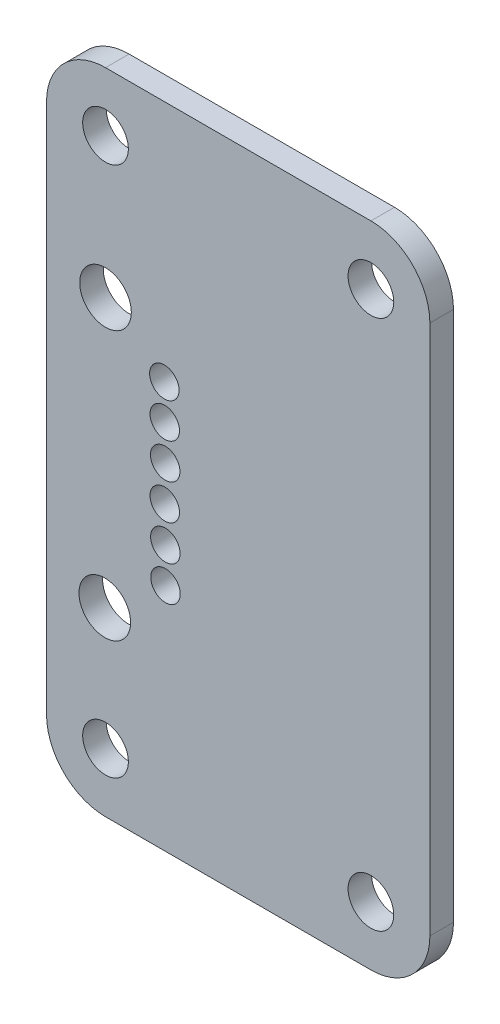
ISO-10303-21;
HEADER;
FILE_DESCRIPTION(('STEP AP214'),'2;1');
FILE_NAME('part.step','',(''),(''),'','','');
FILE_SCHEMA(('AUTOMOTIVE_DESIGN { 1 0 10303 214 1 1 1 1 }'));
ENDSEC;
DATA;
#1=APPLICATION_CONTEXT('core data for automotive mechanical design processes');
#2=APPLICATION_PROTOCOL_DEFINITION('international standard','automotive_design',2000,#1);
#3=PRODUCT_CONTEXT('',#1,'mechanical');
#4=PRODUCT('Part','Part','',(#3));
#5=PRODUCT_RELATED_PRODUCT_CATEGORY('part','',(#4));
#6=PRODUCT_DEFINITION_FORMATION('','',#4);
#7=PRODUCT_DEFINITION_CONTEXT('part definition',#1,'design');
#8=PRODUCT_DEFINITION('design','',#6,#7);
#9=PRODUCT_DEFINITION_SHAPE('','',#8);
#10=(LENGTH_UNIT() NAMED_UNIT(*) SI_UNIT(.MILLI.,.METRE.));
#11=(NAMED_UNIT(*) PLANE_ANGLE_UNIT() SI_UNIT($,.RADIAN.));
#12=(NAMED_UNIT(*) SI_UNIT($,.STERADIAN.) SOLID_ANGLE_UNIT());
#13=UNCERTAINTY_MEASURE_WITH_UNIT(LENGTH_MEASURE(1.E-05),#10,'distance_accuracy_value','');
#14=(GEOMETRIC_REPRESENTATION_CONTEXT(3) GLOBAL_UNCERTAINTY_ASSIGNED_CONTEXT((#13)) GLOBAL_UNIT_ASSIGNED_CONTEXT((#10,
#11,#12)) REPRESENTATION_CONTEXT('',''));
#15=CARTESIAN_POINT('',(0.,0.,0.));
#16=DIRECTION('',(0.,0.,1.));
#17=DIRECTION('',(1.,0.,0.));
#18=AXIS2_PLACEMENT_3D('',#15,#16,#17);
#19=CARTESIAN_POINT('',(-13.,18.,1.6));
#20=DIRECTION('',(0.,0.,-1.));
#21=DIRECTION('',(-1.,0.,0.));
#22=AXIS2_PLACEMENT_3D('',#19,#20,#21);
#23=PLANE('',#22);
#24=CARTESIAN_POINT('',(-9.,18.,1.6));
#25=DIRECTION('',(0.,0.,1.));
#26=DIRECTION('',(1.,0.,0.));
#27=AXIS2_PLACEMENT_3D('',#24,#25,#26);
#28=CIRCLE('',#27,1.55);
#29=CARTESIAN_POINT('',(-7.45,18.,1.6));
#30=VERTEX_POINT('',#29);
#31=EDGE_CURVE('E161',#30,#30,#28,.F.);
#32=ORIENTED_EDGE('',*,*,#31,.T.);
#33=EDGE_LOOP('',(#32));
#34=FACE_BOUND('',#33,.T.);
#35=CARTESIAN_POINT('',(9.,18.,1.6));
#36=DIRECTION('',(0.,0.,1.));
#37=DIRECTION('',(1.,0.,0.));
#38=AXIS2_PLACEMENT_3D('',#35,#36,#37);
#39=CIRCLE('',#38,1.55);
#40=CARTESIAN_POINT('',(10.55,18.,1.6));
#41=VERTEX_POINT('',#40);
#42=EDGE_CURVE('E164',#41,#41,#39,.F.);
#43=ORIENTED_EDGE('',*,*,#42,.T.);
#44=EDGE_LOOP('',(#43));
#45=FACE_BOUND('',#44,.T.);
#46=CARTESIAN_POINT('',(9.,-18.,1.6));
#47=DIRECTION('',(0.,0.,1.));
#48=DIRECTION('',(1.,0.,0.));
#49=AXIS2_PLACEMENT_3D('',#46,#47,#48);
#50=CIRCLE('',#49,1.55);
#51=CARTESIAN_POINT('',(10.55,-18.,1.6));
#52=VERTEX_POINT('',#51);
#53=EDGE_CURVE('E170',#52,#52,#50,.F.);
#54=ORIENTED_EDGE('',*,*,#53,.T.);
#55=EDGE_LOOP('',(#54));
#56=FACE_BOUND('',#55,.T.);
#57=CARTESIAN_POINT('',(-9.,8.5,1.6));
#58=DIRECTION('',(0.,0.,1.));
#59=DIRECTION('',(1.,0.,0.));
#60=AXIS2_PLACEMENT_3D('',#57,#58,#59);
#61=CIRCLE('',#60,1.75);
#62=CARTESIAN_POINT('',(-7.25,8.5,1.6));
#63=VERTEX_POINT('',#62);
#64=EDGE_CURVE('E176',#63,#63,#61,.F.);
#65=ORIENTED_EDGE('',*,*,#64,.T.);
#66=EDGE_LOOP('',(#65));
#67=FACE_BOUND('',#66,.T.);
#68=CARTESIAN_POINT('',(-4.982,-1.62158,1.6));
#69=DIRECTION('',(0.,0.,1.));
#70=DIRECTION('',(1.,0.,0.));
#71=AXIS2_PLACEMENT_3D('',#68,#69,#70);
#72=CIRCLE('',#71,1.);
#73=CARTESIAN_POINT('',(-3.982,-1.62158,1.6));
#74=VERTEX_POINT('',#73);
#75=EDGE_CURVE('E179',#74,#74,#72,.F.);
#76=ORIENTED_EDGE('',*,*,#75,.T.);
#77=EDGE_LOOP('',(#76));
#78=FACE_BOUND('',#77,.T.);
#79=CARTESIAN_POINT('',(-4.95152,0.79396,1.6));
#80=DIRECTION('',(0.,0.,1.));
#81=DIRECTION('',(1.,0.,0.));
#82=AXIS2_PLACEMENT_3D('',#79,#80,#81);
#83=CIRCLE('',#82,1.);
#84=CARTESIAN_POINT('',(-3.95152,0.79396,1.6));
#85=VERTEX_POINT('',#84);
#86=EDGE_CURVE('E188',#85,#85,#83,.F.);
#87=ORIENTED_EDGE('',*,*,#86,.T.);
#88=EDGE_LOOP('',(#87));
#89=FACE_BOUND('',#88,.T.);
#90=CARTESIAN_POINT('',(-4.982,3.17902,1.6));
#91=DIRECTION('',(0.,0.,1.));
#92=DIRECTION('',(1.,0.,0.));
#93=AXIS2_PLACEMENT_3D('',#90,#91,#92);
#94=CIRCLE('',#93,1.);
#95=CARTESIAN_POINT('',(-3.982,3.17902,1.6));
#96=VERTEX_POINT('',#95);
#97=EDGE_CURVE('E191',#96,#96,#94,.F.);
#98=ORIENTED_EDGE('',*,*,#97,.T.);
#99=EDGE_LOOP('',(#98));
#100=FACE_BOUND('',#99,.T.);
#101=CARTESIAN_POINT('',(-5.009331,5.536095,1.6));
#102=DIRECTION('',(0.,0.,1.));
#103=DIRECTION('',(1.,0.,0.));
#104=AXIS2_PLACEMENT_3D('',#101,#102,#103);
#105=CIRCLE('',#104,1.);
#106=CARTESIAN_POINT('',(-4.009331,5.536095,1.6));
#107=VERTEX_POINT('',#106);
#108=EDGE_CURVE('E194',#107,#107,#105,.F.);
#109=ORIENTED_EDGE('',*,*,#108,.T.);
#110=EDGE_LOOP('',(#109));
#111=FACE_BOUND('',#110,.T.);
#112=CARTESIAN_POINT('',(-9.,-18.,1.6));
#113=DIRECTION('',(0.,0.,1.));
#114=DIRECTION('',(1.,0.,0.));
#115=AXIS2_PLACEMENT_3D('',#112,#113,#114);
#116=CIRCLE('',#115,1.55);
#117=CARTESIAN_POINT('',(-7.45,-18.,1.6));
#118=VERTEX_POINT('',#117);
#119=EDGE_CURVE('E167',#118,#118,#116,.F.);
#120=ORIENTED_EDGE('',*,*,#119,.T.);
#121=EDGE_LOOP('',(#120));
#122=FACE_BOUND('',#121,.T.);
#123=CARTESIAN_POINT('',(-4.9312,-6.3917,1.6));
#124=DIRECTION('',(0.,0.,1.));
#125=DIRECTION('',(1.,0.,0.));
#126=AXIS2_PLACEMENT_3D('',#123,#124,#125);
#127=CIRCLE('',#126,1.);
#128=CARTESIAN_POINT('',(-3.9312,-6.3917,1.6));
#129=VERTEX_POINT('',#128);
#130=EDGE_CURVE('E185',#129,#129,#127,.F.);
#131=ORIENTED_EDGE('',*,*,#130,.T.);
#132=EDGE_LOOP('',(#131));
#133=FACE_BOUND('',#132,.T.);
#134=CARTESIAN_POINT('',(-4.94136,-4.01426,1.6));
#135=DIRECTION('',(0.,0.,1.));
#136=DIRECTION('',(1.,0.,0.));
#137=AXIS2_PLACEMENT_3D('',#134,#135,#136);
#138=CIRCLE('',#137,1.);
#139=CARTESIAN_POINT('',(-3.94136,-4.01426,1.6));
#140=VERTEX_POINT('',#139);
#141=EDGE_CURVE('E182',#140,#140,#138,.F.);
#142=ORIENTED_EDGE('',*,*,#141,.T.);
#143=EDGE_LOOP('',(#142));
#144=FACE_BOUND('',#143,.T.);
#145=CARTESIAN_POINT('',(-9.049331,-9.75,1.6));
#146=DIRECTION('',(0.,0.,1.));
#147=DIRECTION('',(1.,0.,0.));
#148=AXIS2_PLACEMENT_3D('',#145,#146,#147);
#149=CIRCLE('',#148,1.75);
#150=CARTESIAN_POINT('',(-7.299331,-9.75,1.6));
#151=VERTEX_POINT('',#150);
#152=EDGE_CURVE('E173',#151,#151,#149,.F.);
#153=ORIENTED_EDGE('',*,*,#152,.T.);
#154=EDGE_LOOP('',(#153));
#155=FACE_BOUND('',#154,.T.);
#156=DIRECTION('',(1.,0.,0.));
#157=VECTOR('',#156,1.);
#158=CARTESIAN_POINT('',(-9.,-22.,1.6));
#159=LINE('',#158,#157);
#160=CARTESIAN_POINT('',(-9.,-22.,1.6));
#161=VERTEX_POINT('',#160);
#162=CARTESIAN_POINT('',(9.,-22.,1.6));
#163=VERTEX_POINT('',#162);
#164=EDGE_CURVE('E108',#161,#163,#159,.T.);
#165=ORIENTED_EDGE('',*,*,#164,.T.);
#166=CARTESIAN_POINT('',(9.,-18.,1.6));
#167=DIRECTION('',(0.,0.,-1.));
#168=DIRECTION('',(-1.,0.,0.));
#169=AXIS2_PLACEMENT_3D('',#166,#167,#168);
#170=CIRCLE('',#169,4.);
#171=CARTESIAN_POINT('',(13.,-18.,1.6));
#172=VERTEX_POINT('',#171);
#173=EDGE_CURVE('E111',#172,#163,#170,.T.);
#174=ORIENTED_EDGE('',*,*,#173,.F.);
#175=DIRECTION('',(0.,1.,0.));
#176=VECTOR('',#175,1.);
#177=CARTESIAN_POINT('',(13.,-18.,1.6));
#178=LINE('',#177,#176);
#179=CARTESIAN_POINT('',(13.,18.,1.6));
#180=VERTEX_POINT('',#179);
#181=EDGE_CURVE('E112',#172,#180,#178,.T.);
#182=ORIENTED_EDGE('',*,*,#181,.T.);
#183=CARTESIAN_POINT('',(9.,18.,1.6));
#184=DIRECTION('',(0.,0.,-1.));
#185=DIRECTION('',(-1.,0.,0.));
#186=AXIS2_PLACEMENT_3D('',#183,#184,#185);
#187=CIRCLE('',#186,4.);
#188=CARTESIAN_POINT('',(9.,22.,1.6));
#189=VERTEX_POINT('',#188);
#190=EDGE_CURVE('E86',#189,#180,#187,.T.);
#191=ORIENTED_EDGE('',*,*,#190,.F.);
#192=DIRECTION('',(1.,0.,0.));
#193=VECTOR('',#192,1.);
#194=CARTESIAN_POINT('',(9.,22.,1.6));
#195=LINE('',#194,#193);
#196=CARTESIAN_POINT('',(-9.,22.,1.6));
#197=VERTEX_POINT('',#196);
#198=EDGE_CURVE('E82',#189,#197,#195,.F.);
#199=ORIENTED_EDGE('',*,*,#198,.T.);
#200=CARTESIAN_POINT('',(-9.,18.,1.6));
#201=DIRECTION('',(0.,0.,-1.));
#202=DIRECTION('',(-1.,0.,0.));
#203=AXIS2_PLACEMENT_3D('',#200,#201,#202);
#204=CIRCLE('',#203,4.);
#205=CARTESIAN_POINT('',(-13.,18.,1.6));
#206=VERTEX_POINT('',#205);
#207=EDGE_CURVE('E19',#206,#197,#204,.T.);
#208=ORIENTED_EDGE('',*,*,#207,.F.);
#209=DIRECTION('',(0.,1.,0.));
#210=VECTOR('',#209,1.);
#211=CARTESIAN_POINT('',(-13.,18.,1.6));
#212=LINE('',#211,#210);
#213=CARTESIAN_POINT('',(-13.,-18.,1.6));
#214=VERTEX_POINT('',#213);
#215=EDGE_CURVE('E77',#206,#214,#212,.F.);
#216=ORIENTED_EDGE('',*,*,#215,.T.);
#217=CARTESIAN_POINT('',(-9.,-18.,1.6));
#218=DIRECTION('',(0.,0.,-1.));
#219=DIRECTION('',(-1.,0.,0.));
#220=AXIS2_PLACEMENT_3D('',#217,#218,#219);
#221=CIRCLE('',#220,4.);
#222=EDGE_CURVE('E198',#161,#214,#221,.T.);
#223=ORIENTED_EDGE('',*,*,#222,.F.);
#224=EDGE_LOOP('',(#165,#174,#182,#191,#199,#208,#216,#223));
#225=FACE_BOUND('',#224,.T.);
#226=ADVANCED_FACE('F16',(#34,#45,#56,#67,#78,#89,#100,#111,#122,#133,#144,#155,#225),#23,.F.);
#227=CARTESIAN_POINT('',(-13.,18.,0.));
#228=DIRECTION('',(1.,0.,0.));
#229=DIRECTION('',(0.,0.,-1.));
#230=AXIS2_PLACEMENT_3D('',#227,#228,#229);
#231=PLANE('',#230);
#232=DIRECTION('',(0.,0.,-1.));
#233=VECTOR('',#232,1.);
#234=CARTESIAN_POINT('',(-13.,-18.,0.));
#235=LINE('',#234,#233);
#236=CARTESIAN_POINT('',(-13.,-18.,0.));
#237=VERTEX_POINT('',#236);
#238=EDGE_CURVE('E197',#214,#237,#235,.T.);
#239=ORIENTED_EDGE('',*,*,#238,.F.);
#240=ORIENTED_EDGE('',*,*,#215,.F.);
#241=DIRECTION('',(0.,0.,-1.));
#242=VECTOR('',#241,1.);
#243=CARTESIAN_POINT('',(-13.,18.,0.));
#244=LINE('',#243,#242);
#245=CARTESIAN_POINT('',(-13.,18.,0.));
#246=VERTEX_POINT('',#245);
#247=EDGE_CURVE('E96',#246,#206,#244,.F.);
#248=ORIENTED_EDGE('',*,*,#247,.F.);
#249=DIRECTION('',(0.,1.,0.));
#250=VECTOR('',#249,1.);
#251=CARTESIAN_POINT('',(-13.,18.,0.));
#252=LINE('',#251,#250);
#253=EDGE_CURVE('E160',#237,#246,#252,.T.);
#254=ORIENTED_EDGE('',*,*,#253,.F.);
#255=EDGE_LOOP('',(#239,#240,#248,#254));
#256=FACE_BOUND('',#255,.T.);
#257=ADVANCED_FACE('F234',(#256),#231,.F.);
#258=CARTESIAN_POINT('',(-9.,18.,0.));
#259=DIRECTION('',(0.,0.,-1.));
#260=DIRECTION('',(-1.,0.,0.));
#261=AXIS2_PLACEMENT_3D('',#258,#259,#260);
#262=CYLINDRICAL_SURFACE('',#261,4.);
#263=ORIENTED_EDGE('',*,*,#207,.T.);
#264=DIRECTION('',(0.,0.,-1.));
#265=VECTOR('',#264,1.);
#266=CARTESIAN_POINT('',(-9.,22.,0.));
#267=LINE('',#266,#265);
#268=CARTESIAN_POINT('',(-9.,22.,0.));
#269=VERTEX_POINT('',#268);
#270=EDGE_CURVE('E90',#197,#269,#267,.T.);
#271=ORIENTED_EDGE('',*,*,#270,.T.);
#272=CARTESIAN_POINT('',(-9.,18.,0.));
#273=DIRECTION('',(0.,0.,-1.));
#274=DIRECTION('',(-1.,0.,0.));
#275=AXIS2_PLACEMENT_3D('',#272,#273,#274);
#276=CIRCLE('',#275,4.);
#277=EDGE_CURVE('E158',#246,#269,#276,.T.);
#278=ORIENTED_EDGE('',*,*,#277,.F.);
#279=ORIENTED_EDGE('',*,*,#247,.T.);
#280=EDGE_LOOP('',(#263,#271,#278,#279));
#281=FACE_BOUND('',#280,.T.);
#282=ADVANCED_FACE('F93',(#281),#262,.T.);
#283=CARTESIAN_POINT('',(9.,22.,0.));
#284=DIRECTION('',(0.,-1.,0.));
#285=DIRECTION('',(0.,0.,-1.));
#286=AXIS2_PLACEMENT_3D('',#283,#284,#285);
#287=PLANE('',#286);
#288=ORIENTED_EDGE('',*,*,#270,.F.);
#289=ORIENTED_EDGE('',*,*,#198,.F.);
#290=DIRECTION('',(0.,0.,-1.));
#291=VECTOR('',#290,1.);
#292=CARTESIAN_POINT('',(9.,22.,0.));
#293=LINE('',#292,#291);
#294=CARTESIAN_POINT('',(9.,22.,0.));
#295=VERTEX_POINT('',#294);
#296=EDGE_CURVE('E101',#295,#189,#293,.F.);
#297=ORIENTED_EDGE('',*,*,#296,.F.);
#298=DIRECTION('',(-1.,0.,0.));
#299=VECTOR('',#298,1.);
#300=CARTESIAN_POINT('',(-13.,22.,0.));
#301=LINE('',#300,#299);
#302=EDGE_CURVE('E99',#269,#295,#301,.F.);
#303=ORIENTED_EDGE('',*,*,#302,.F.);
#304=EDGE_LOOP('',(#288,#289,#297,#303));
#305=FACE_BOUND('',#304,.T.);
#306=ADVANCED_FACE('F97',(#305),#287,.F.);
#307=CARTESIAN_POINT('',(9.,18.,0.));
#308=DIRECTION('',(0.,0.,-1.));
#309=DIRECTION('',(-1.,0.,0.));
#310=AXIS2_PLACEMENT_3D('',#307,#308,#309);
#311=CYLINDRICAL_SURFACE('',#310,4.);
#312=ORIENTED_EDGE('',*,*,#190,.T.);
#313=DIRECTION('',(0.,0.,1.));
#314=VECTOR('',#313,1.);
#315=CARTESIAN_POINT('',(13.,18.,0.));
#316=LINE('',#315,#314);
#317=CARTESIAN_POINT('',(13.,18.,0.));
#318=VERTEX_POINT('',#317);
#319=EDGE_CURVE('E113',#180,#318,#316,.F.);
#320=ORIENTED_EDGE('',*,*,#319,.T.);
#321=CARTESIAN_POINT('',(9.,18.,0.));
#322=DIRECTION('',(0.,0.,-1.));
#323=DIRECTION('',(-1.,0.,0.));
#324=AXIS2_PLACEMENT_3D('',#321,#322,#323);
#325=CIRCLE('',#324,4.);
#326=EDGE_CURVE('E155',#295,#318,#325,.T.);
#327=ORIENTED_EDGE('',*,*,#326,.F.);
#328=ORIENTED_EDGE('',*,*,#296,.T.);
#329=EDGE_LOOP('',(#312,#320,#327,#328));
#330=FACE_BOUND('',#329,.T.);
#331=ADVANCED_FACE('F205',(#330),#311,.T.);
#332=CARTESIAN_POINT('',(13.,-18.,0.));
#333=DIRECTION('',(-1.,0.,0.));
#334=DIRECTION('',(0.,0.,1.));
#335=AXIS2_PLACEMENT_3D('',#332,#333,#334);
#336=PLANE('',#335);
#337=ORIENTED_EDGE('',*,*,#319,.F.);
#338=ORIENTED_EDGE('',*,*,#181,.F.);
#339=DIRECTION('',(0.,0.,-1.));
#340=VECTOR('',#339,1.);
#341=CARTESIAN_POINT('',(13.,-18.,0.));
#342=LINE('',#341,#340);
#343=CARTESIAN_POINT('',(13.,-18.,0.));
#344=VERTEX_POINT('',#343);
#345=EDGE_CURVE('E202',#344,#172,#342,.F.);
#346=ORIENTED_EDGE('',*,*,#345,.F.);
#347=DIRECTION('',(0.,1.,0.));
#348=VECTOR('',#347,1.);
#349=CARTESIAN_POINT('',(13.,18.,0.));
#350=LINE('',#349,#348);
#351=EDGE_CURVE('E154',#318,#344,#350,.F.);
#352=ORIENTED_EDGE('',*,*,#351,.F.);
#353=EDGE_LOOP('',(#337,#338,#346,#352));
#354=FACE_BOUND('',#353,.T.);
#355=ADVANCED_FACE('F209',(#354),#336,.F.);
#356=CARTESIAN_POINT('',(9.,-18.,0.));
#357=DIRECTION('',(0.,0.,-1.));
#358=DIRECTION('',(-1.,0.,0.));
#359=AXIS2_PLACEMENT_3D('',#356,#357,#358);
#360=CYLINDRICAL_SURFACE('',#359,4.);
#361=ORIENTED_EDGE('',*,*,#173,.T.);
#362=DIRECTION('',(0.,0.,1.));
#363=VECTOR('',#362,1.);
#364=CARTESIAN_POINT('',(9.,-22.,0.));
#365=LINE('',#364,#363);
#366=CARTESIAN_POINT('',(9.,-22.,0.));
#367=VERTEX_POINT('',#366);
#368=EDGE_CURVE('E110',#163,#367,#365,.F.);
#369=ORIENTED_EDGE('',*,*,#368,.T.);
#370=CARTESIAN_POINT('',(9.,-18.,0.));
#371=DIRECTION('',(0.,0.,-1.));
#372=DIRECTION('',(-1.,0.,0.));
#373=AXIS2_PLACEMENT_3D('',#370,#371,#372);
#374=CIRCLE('',#373,4.);
#375=EDGE_CURVE('E151',#344,#367,#374,.T.);
#376=ORIENTED_EDGE('',*,*,#375,.F.);
#377=ORIENTED_EDGE('',*,*,#345,.T.);
#378=EDGE_LOOP('',(#361,#369,#376,#377));
#379=FACE_BOUND('',#378,.T.);
#380=ADVANCED_FACE('F231',(#379),#360,.T.);
#381=CARTESIAN_POINT('',(-9.,-22.,0.));
#382=DIRECTION('',(0.,1.,0.));
#383=DIRECTION('',(0.,0.,1.));
#384=AXIS2_PLACEMENT_3D('',#381,#382,#383);
#385=PLANE('',#384);
#386=ORIENTED_EDGE('',*,*,#368,.F.);
#387=ORIENTED_EDGE('',*,*,#164,.F.);
#388=DIRECTION('',(0.,0.,-1.));
#389=VECTOR('',#388,1.);
#390=CARTESIAN_POINT('',(-9.,-22.,0.));
#391=LINE('',#390,#389);
#392=CARTESIAN_POINT('',(-9.,-22.,0.));
#393=VERTEX_POINT('',#392);
#394=EDGE_CURVE('E34',#393,#161,#391,.F.);
#395=ORIENTED_EDGE('',*,*,#394,.F.);
#396=DIRECTION('',(-1.,0.,0.));
#397=VECTOR('',#396,1.);
#398=CARTESIAN_POINT('',(-13.,-22.,0.));
#399=LINE('',#398,#397);
#400=EDGE_CURVE('E150',#367,#393,#399,.T.);
#401=ORIENTED_EDGE('',*,*,#400,.F.);
#402=EDGE_LOOP('',(#386,#387,#395,#401));
#403=FACE_BOUND('',#402,.T.);
#404=ADVANCED_FACE('F228',(#403),#385,.F.);
#405=CARTESIAN_POINT('',(-9.,-18.,0.));
#406=DIRECTION('',(0.,0.,-1.));
#407=DIRECTION('',(-1.,0.,0.));
#408=AXIS2_PLACEMENT_3D('',#405,#406,#407);
#409=CYLINDRICAL_SURFACE('',#408,4.);
#410=ORIENTED_EDGE('',*,*,#222,.T.);
#411=ORIENTED_EDGE('',*,*,#238,.T.);
#412=CARTESIAN_POINT('',(-9.,-18.,0.));
#413=DIRECTION('',(0.,0.,-1.));
#414=DIRECTION('',(-1.,0.,0.));
#415=AXIS2_PLACEMENT_3D('',#412,#413,#414);
#416=CIRCLE('',#415,4.);
#417=EDGE_CURVE('E147',#393,#237,#416,.T.);
#418=ORIENTED_EDGE('',*,*,#417,.F.);
#419=ORIENTED_EDGE('',*,*,#394,.T.);
#420=EDGE_LOOP('',(#410,#411,#418,#419));
#421=FACE_BOUND('',#420,.T.);
#422=ADVANCED_FACE('F233',(#421),#409,.T.);
#423=CARTESIAN_POINT('',(-5.009331,5.536095,-0.8));
#424=DIRECTION('',(0.,0.,1.));
#425=DIRECTION('',(1.,0.,0.));
#426=AXIS2_PLACEMENT_3D('',#423,#424,#425);
#427=CYLINDRICAL_SURFACE('',#426,1.);
#428=CARTESIAN_POINT('',(-5.009331,5.536095,0.));
#429=DIRECTION('',(0.,0.,1.));
#430=DIRECTION('',(1.,0.,0.));
#431=AXIS2_PLACEMENT_3D('',#428,#429,#430);
#432=CIRCLE('',#431,1.);
#433=CARTESIAN_POINT('',(-4.009331,5.536095,0.));
#434=VERTEX_POINT('',#433);
#435=EDGE_CURVE('E144',#434,#434,#432,.T.);
#436=ORIENTED_EDGE('',*,*,#435,.F.);
#437=EDGE_LOOP('',(#436));
#438=FACE_BOUND('',#437,.T.);
#439=ORIENTED_EDGE('',*,*,#108,.F.);
#440=EDGE_LOOP('',(#439));
#441=FACE_BOUND('',#440,.T.);
#442=ADVANCED_FACE('F293',(#438,#441),#427,.F.);
#443=CARTESIAN_POINT('',(-4.982,3.17902,-0.8));
#444=DIRECTION('',(0.,0.,1.));
#445=DIRECTION('',(1.,0.,0.));
#446=AXIS2_PLACEMENT_3D('',#443,#444,#445);
#447=CYLINDRICAL_SURFACE('',#446,1.);
#448=CARTESIAN_POINT('',(-4.982,3.17902,0.));
#449=DIRECTION('',(0.,0.,1.));
#450=DIRECTION('',(1.,0.,0.));
#451=AXIS2_PLACEMENT_3D('',#448,#449,#450);
#452=CIRCLE('',#451,1.);
#453=CARTESIAN_POINT('',(-3.982,3.17902,0.));
#454=VERTEX_POINT('',#453);
#455=EDGE_CURVE('E141',#454,#454,#452,.T.);
#456=ORIENTED_EDGE('',*,*,#455,.F.);
#457=EDGE_LOOP('',(#456));
#458=FACE_BOUND('',#457,.T.);
#459=ORIENTED_EDGE('',*,*,#97,.F.);
#460=EDGE_LOOP('',(#459));
#461=FACE_BOUND('',#460,.T.);
#462=ADVANCED_FACE('F289',(#458,#461),#447,.F.);
#463=CARTESIAN_POINT('',(-4.95152,0.79396,-0.8));
#464=DIRECTION('',(0.,0.,1.));
#465=DIRECTION('',(1.,0.,0.));
#466=AXIS2_PLACEMENT_3D('',#463,#464,#465);
#467=CYLINDRICAL_SURFACE('',#466,1.);
#468=CARTESIAN_POINT('',(-4.95152,0.79396,0.));
#469=DIRECTION('',(0.,0.,1.));
#470=DIRECTION('',(1.,0.,0.));
#471=AXIS2_PLACEMENT_3D('',#468,#469,#470);
#472=CIRCLE('',#471,1.);
#473=CARTESIAN_POINT('',(-3.95152,0.79396,0.));
#474=VERTEX_POINT('',#473);
#475=EDGE_CURVE('E138',#474,#474,#472,.T.);
#476=ORIENTED_EDGE('',*,*,#475,.F.);
#477=EDGE_LOOP('',(#476));
#478=FACE_BOUND('',#477,.T.);
#479=ORIENTED_EDGE('',*,*,#86,.F.);
#480=EDGE_LOOP('',(#479));
#481=FACE_BOUND('',#480,.T.);
#482=ADVANCED_FACE('F285',(#478,#481),#467,.F.);
#483=CARTESIAN_POINT('',(-4.9312,-6.3917,-0.8));
#484=DIRECTION('',(0.,0.,1.));
#485=DIRECTION('',(1.,0.,0.));
#486=AXIS2_PLACEMENT_3D('',#483,#484,#485);
#487=CYLINDRICAL_SURFACE('',#486,1.);
#488=CARTESIAN_POINT('',(-4.9312,-6.3917,0.));
#489=DIRECTION('',(0.,0.,1.));
#490=DIRECTION('',(1.,0.,0.));
#491=AXIS2_PLACEMENT_3D('',#488,#489,#490);
#492=CIRCLE('',#491,1.);
#493=CARTESIAN_POINT('',(-3.9312,-6.3917,0.));
#494=VERTEX_POINT('',#493);
#495=EDGE_CURVE('E135',#494,#494,#492,.T.);
#496=ORIENTED_EDGE('',*,*,#495,.F.);
#497=EDGE_LOOP('',(#496));
#498=FACE_BOUND('',#497,.T.);
#499=ORIENTED_EDGE('',*,*,#130,.F.);
#500=EDGE_LOOP('',(#499));
#501=FACE_BOUND('',#500,.T.);
#502=ADVANCED_FACE('F281',(#498,#501),#487,.F.);
#503=CARTESIAN_POINT('',(-4.94136,-4.01426,-0.8));
#504=DIRECTION('',(0.,0.,1.));
#505=DIRECTION('',(1.,0.,0.));
#506=AXIS2_PLACEMENT_3D('',#503,#504,#505);
#507=CYLINDRICAL_SURFACE('',#506,1.);
#508=CARTESIAN_POINT('',(-4.94136,-4.01426,0.));
#509=DIRECTION('',(0.,0.,1.));
#510=DIRECTION('',(1.,0.,0.));
#511=AXIS2_PLACEMENT_3D('',#508,#509,#510);
#512=CIRCLE('',#511,1.);
#513=CARTESIAN_POINT('',(-3.94136,-4.01426,0.));
#514=VERTEX_POINT('',#513);
#515=EDGE_CURVE('E132',#514,#514,#512,.T.);
#516=ORIENTED_EDGE('',*,*,#515,.F.);
#517=EDGE_LOOP('',(#516));
#518=FACE_BOUND('',#517,.T.);
#519=ORIENTED_EDGE('',*,*,#141,.F.);
#520=EDGE_LOOP('',(#519));
#521=FACE_BOUND('',#520,.T.);
#522=ADVANCED_FACE('F277',(#518,#521),#507,.F.);
#523=CARTESIAN_POINT('',(-4.982,-1.62158,-0.8));
#524=DIRECTION('',(0.,0.,1.));
#525=DIRECTION('',(1.,0.,0.));
#526=AXIS2_PLACEMENT_3D('',#523,#524,#525);
#527=CYLINDRICAL_SURFACE('',#526,1.);
#528=CARTESIAN_POINT('',(-4.982,-1.62158,0.));
#529=DIRECTION('',(0.,0.,1.));
#530=DIRECTION('',(1.,0.,0.));
#531=AXIS2_PLACEMENT_3D('',#528,#529,#530);
#532=CIRCLE('',#531,1.);
#533=CARTESIAN_POINT('',(-3.982,-1.62158,0.));
#534=VERTEX_POINT('',#533);
#535=EDGE_CURVE('E129',#534,#534,#532,.T.);
#536=ORIENTED_EDGE('',*,*,#535,.F.);
#537=EDGE_LOOP('',(#536));
#538=FACE_BOUND('',#537,.T.);
#539=ORIENTED_EDGE('',*,*,#75,.F.);
#540=EDGE_LOOP('',(#539));
#541=FACE_BOUND('',#540,.T.);
#542=ADVANCED_FACE('F273',(#538,#541),#527,.F.);
#543=CARTESIAN_POINT('',(-9.,8.5,-0.8));
#544=DIRECTION('',(0.,0.,1.));
#545=DIRECTION('',(1.,0.,0.));
#546=AXIS2_PLACEMENT_3D('',#543,#544,#545);
#547=CYLINDRICAL_SURFACE('',#546,1.75);
#548=CARTESIAN_POINT('',(-9.,8.5,0.));
#549=DIRECTION('',(0.,0.,1.));
#550=DIRECTION('',(1.,0.,0.));
#551=AXIS2_PLACEMENT_3D('',#548,#549,#550);
#552=CIRCLE('',#551,1.75);
#553=CARTESIAN_POINT('',(-7.25,8.5,0.));
#554=VERTEX_POINT('',#553);
#555=EDGE_CURVE('E126',#554,#554,#552,.T.);
#556=ORIENTED_EDGE('',*,*,#555,.F.);
#557=EDGE_LOOP('',(#556));
#558=FACE_BOUND('',#557,.T.);
#559=ORIENTED_EDGE('',*,*,#64,.F.);
#560=EDGE_LOOP('',(#559));
#561=FACE_BOUND('',#560,.T.);
#562=ADVANCED_FACE('F269',(#558,#561),#547,.F.);
#563=CARTESIAN_POINT('',(-9.049331,-9.75,-0.8));
#564=DIRECTION('',(0.,0.,1.));
#565=DIRECTION('',(1.,0.,0.));
#566=AXIS2_PLACEMENT_3D('',#563,#564,#565);
#567=CYLINDRICAL_SURFACE('',#566,1.75);
#568=CARTESIAN_POINT('',(-9.049331,-9.75,0.));
#569=DIRECTION('',(0.,0.,1.));
#570=DIRECTION('',(1.,0.,0.));
#571=AXIS2_PLACEMENT_3D('',#568,#569,#570);
#572=CIRCLE('',#571,1.75);
#573=CARTESIAN_POINT('',(-7.299331,-9.75,0.));
#574=VERTEX_POINT('',#573);
#575=EDGE_CURVE('E123',#574,#574,#572,.T.);
#576=ORIENTED_EDGE('',*,*,#575,.F.);
#577=EDGE_LOOP('',(#576));
#578=FACE_BOUND('',#577,.T.);
#579=ORIENTED_EDGE('',*,*,#152,.F.);
#580=EDGE_LOOP('',(#579));
#581=FACE_BOUND('',#580,.T.);
#582=ADVANCED_FACE('F265',(#578,#581),#567,.F.);
#583=CARTESIAN_POINT('',(9.,-18.,-0.8));
#584=DIRECTION('',(0.,0.,1.));
#585=DIRECTION('',(1.,0.,0.));
#586=AXIS2_PLACEMENT_3D('',#583,#584,#585);
#587=CYLINDRICAL_SURFACE('',#586,1.55);
#588=CARTESIAN_POINT('',(9.,-18.,0.));
#589=DIRECTION('',(0.,0.,1.));
#590=DIRECTION('',(1.,0.,0.));
#591=AXIS2_PLACEMENT_3D('',#588,#589,#590);
#592=CIRCLE('',#591,1.55);
#593=CARTESIAN_POINT('',(10.55,-18.,0.));
#594=VERTEX_POINT('',#593);
#595=EDGE_CURVE('E120',#594,#594,#592,.T.);
#596=ORIENTED_EDGE('',*,*,#595,.F.);
#597=EDGE_LOOP('',(#596));
#598=FACE_BOUND('',#597,.T.);
#599=ORIENTED_EDGE('',*,*,#53,.F.);
#600=EDGE_LOOP('',(#599));
#601=FACE_BOUND('',#600,.T.);
#602=ADVANCED_FACE('F261',(#598,#601),#587,.F.);
#603=CARTESIAN_POINT('',(-9.,-18.,-0.8));
#604=DIRECTION('',(0.,0.,1.));
#605=DIRECTION('',(1.,0.,0.));
#606=AXIS2_PLACEMENT_3D('',#603,#604,#605);
#607=CYLINDRICAL_SURFACE('',#606,1.55);
#608=CARTESIAN_POINT('',(-9.,-18.,0.));
#609=DIRECTION('',(0.,0.,1.));
#610=DIRECTION('',(1.,0.,0.));
#611=AXIS2_PLACEMENT_3D('',#608,#609,#610);
#612=CIRCLE('',#611,1.55);
#613=CARTESIAN_POINT('',(-7.45,-18.,0.));
#614=VERTEX_POINT('',#613);
#615=EDGE_CURVE('E117',#614,#614,#612,.T.);
#616=ORIENTED_EDGE('',*,*,#615,.F.);
#617=EDGE_LOOP('',(#616));
#618=FACE_BOUND('',#617,.T.);
#619=ORIENTED_EDGE('',*,*,#119,.F.);
#620=EDGE_LOOP('',(#619));
#621=FACE_BOUND('',#620,.T.);
#622=ADVANCED_FACE('F257',(#618,#621),#607,.F.);
#623=CARTESIAN_POINT('',(9.,18.,-0.8));
#624=DIRECTION('',(0.,0.,1.));
#625=DIRECTION('',(1.,0.,0.));
#626=AXIS2_PLACEMENT_3D('',#623,#624,#625);
#627=CYLINDRICAL_SURFACE('',#626,1.55);
#628=CARTESIAN_POINT('',(9.,18.,0.));
#629=DIRECTION('',(0.,0.,1.));
#630=DIRECTION('',(1.,0.,0.));
#631=AXIS2_PLACEMENT_3D('',#628,#629,#630);
#632=CIRCLE('',#631,1.55);
#633=CARTESIAN_POINT('',(10.55,18.,0.));
#634=VERTEX_POINT('',#633);
#635=EDGE_CURVE('E25',#634,#634,#632,.T.);
#636=ORIENTED_EDGE('',*,*,#635,.F.);
#637=EDGE_LOOP('',(#636));
#638=FACE_BOUND('',#637,.T.);
#639=ORIENTED_EDGE('',*,*,#42,.F.);
#640=EDGE_LOOP('',(#639));
#641=FACE_BOUND('',#640,.T.);
#642=ADVANCED_FACE('F250',(#638,#641),#627,.F.);
#643=CARTESIAN_POINT('',(-9.,18.,-0.8));
#644=DIRECTION('',(0.,0.,1.));
#645=DIRECTION('',(1.,0.,0.));
#646=AXIS2_PLACEMENT_3D('',#643,#644,#645);
#647=CYLINDRICAL_SURFACE('',#646,1.55);
#648=CARTESIAN_POINT('',(-9.,18.,0.));
#649=DIRECTION('',(0.,0.,1.));
#650=DIRECTION('',(1.,0.,0.));
#651=AXIS2_PLACEMENT_3D('',#648,#649,#650);
#652=CIRCLE('',#651,1.55);
#653=CARTESIAN_POINT('',(-7.45,18.,0.));
#654=VERTEX_POINT('',#653);
#655=EDGE_CURVE('E10',#654,#654,#652,.T.);
#656=ORIENTED_EDGE('',*,*,#655,.F.);
#657=EDGE_LOOP('',(#656));
#658=FACE_BOUND('',#657,.T.);
#659=ORIENTED_EDGE('',*,*,#31,.F.);
#660=EDGE_LOOP('',(#659));
#661=FACE_BOUND('',#660,.T.);
#662=ADVANCED_FACE('F244',(#658,#661),#647,.F.);
#663=CARTESIAN_POINT('',(-13.,18.,0.));
#664=DIRECTION('',(0.,0.,-1.));
#665=DIRECTION('',(-1.,0.,0.));
#666=AXIS2_PLACEMENT_3D('',#663,#664,#665);
#667=PLANE('',#666);
#668=ORIENTED_EDGE('',*,*,#655,.T.);
#669=EDGE_LOOP('',(#668));
#670=FACE_BOUND('',#669,.T.);
#671=ORIENTED_EDGE('',*,*,#635,.T.);
#672=EDGE_LOOP('',(#671));
#673=FACE_BOUND('',#672,.T.);
#674=ORIENTED_EDGE('',*,*,#615,.T.);
#675=EDGE_LOOP('',(#674));
#676=FACE_BOUND('',#675,.T.);
#677=ORIENTED_EDGE('',*,*,#595,.T.);
#678=EDGE_LOOP('',(#677));
#679=FACE_BOUND('',#678,.T.);
#680=ORIENTED_EDGE('',*,*,#575,.T.);
#681=EDGE_LOOP('',(#680));
#682=FACE_BOUND('',#681,.T.);
#683=ORIENTED_EDGE('',*,*,#555,.T.);
#684=EDGE_LOOP('',(#683));
#685=FACE_BOUND('',#684,.T.);
#686=ORIENTED_EDGE('',*,*,#535,.T.);
#687=EDGE_LOOP('',(#686));
#688=FACE_BOUND('',#687,.T.);
#689=ORIENTED_EDGE('',*,*,#515,.T.);
#690=EDGE_LOOP('',(#689));
#691=FACE_BOUND('',#690,.T.);
#692=ORIENTED_EDGE('',*,*,#495,.T.);
#693=EDGE_LOOP('',(#692));
#694=FACE_BOUND('',#693,.T.);
#695=ORIENTED_EDGE('',*,*,#475,.T.);
#696=EDGE_LOOP('',(#695));
#697=FACE_BOUND('',#696,.T.);
#698=ORIENTED_EDGE('',*,*,#455,.T.);
#699=EDGE_LOOP('',(#698));
#700=FACE_BOUND('',#699,.T.);
#701=ORIENTED_EDGE('',*,*,#435,.T.);
#702=EDGE_LOOP('',(#701));
#703=FACE_BOUND('',#702,.T.);
#704=ORIENTED_EDGE('',*,*,#400,.T.);
#705=ORIENTED_EDGE('',*,*,#417,.T.);
#706=ORIENTED_EDGE('',*,*,#253,.T.);
#707=ORIENTED_EDGE('',*,*,#277,.T.);
#708=ORIENTED_EDGE('',*,*,#302,.T.);
#709=ORIENTED_EDGE('',*,*,#326,.T.);
#710=ORIENTED_EDGE('',*,*,#351,.T.);
#711=ORIENTED_EDGE('',*,*,#375,.T.);
#712=EDGE_LOOP('',(#704,#705,#706,#707,#708,#709,#710,#711));
#713=FACE_BOUND('',#712,.T.);
#714=ADVANCED_FACE('F225',(#670,#673,#676,#679,#682,#685,#688,#691,#694,#697,#700,#703,#713),
#667,.T.);
#715=CLOSED_SHELL('',(#226,#257,#282,#306,#331,#355,#380,#404,#422,#442,#462,#482,#502,#522,
#542,#562,#582,#602,#622,#642,#662,#714));
#716=MANIFOLD_SOLID_BREP('B1',#715);
#717=ADVANCED_BREP_SHAPE_REPRESENTATION('',(#18,#716),#14);
#718=SHAPE_DEFINITION_REPRESENTATION(#9,#717);
ENDSEC;
END-ISO-10303-21;
